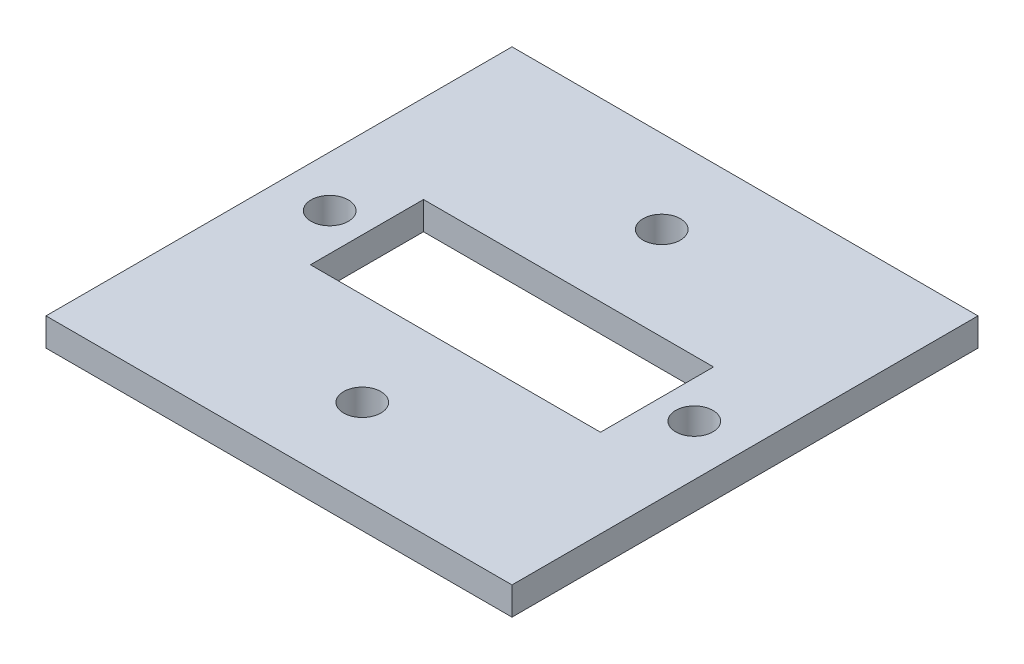
ISO-10303-21;
HEADER;
FILE_DESCRIPTION(('STEP AP214'),'2;1');
FILE_NAME('part.step','',(''),(''),'','','');
FILE_SCHEMA(('AUTOMOTIVE_DESIGN { 1 0 10303 214 1 1 1 1 }'));
ENDSEC;
DATA;
#1=APPLICATION_CONTEXT('core data for automotive mechanical design processes');
#2=APPLICATION_PROTOCOL_DEFINITION('international standard','automotive_design',2000,#1);
#3=PRODUCT_CONTEXT('',#1,'mechanical');
#4=PRODUCT('Part','Part','',(#3));
#5=PRODUCT_RELATED_PRODUCT_CATEGORY('part','',(#4));
#6=PRODUCT_DEFINITION_FORMATION('','',#4);
#7=PRODUCT_DEFINITION_CONTEXT('part definition',#1,'design');
#8=PRODUCT_DEFINITION('design','',#6,#7);
#9=PRODUCT_DEFINITION_SHAPE('','',#8);
#10=(LENGTH_UNIT() NAMED_UNIT(*) SI_UNIT(.MILLI.,.METRE.));
#11=(NAMED_UNIT(*) PLANE_ANGLE_UNIT() SI_UNIT($,.RADIAN.));
#12=(NAMED_UNIT(*) SI_UNIT($,.STERADIAN.) SOLID_ANGLE_UNIT());
#13=UNCERTAINTY_MEASURE_WITH_UNIT(LENGTH_MEASURE(1.E-05),#10,'distance_accuracy_value','');
#14=(GEOMETRIC_REPRESENTATION_CONTEXT(3) GLOBAL_UNCERTAINTY_ASSIGNED_CONTEXT((#13)) GLOBAL_UNIT_ASSIGNED_CONTEXT((#10,
#11,#12)) REPRESENTATION_CONTEXT('',''));
#15=CARTESIAN_POINT('',(0.,0.,0.));
#16=DIRECTION('',(0.,0.,1.));
#17=DIRECTION('',(1.,0.,0.));
#18=AXIS2_PLACEMENT_3D('',#15,#16,#17);
#19=CARTESIAN_POINT('',(0.,3.,0.));
#20=DIRECTION('',(1.,0.,0.));
#21=DIRECTION('',(0.,0.,-1.));
#22=AXIS2_PLACEMENT_3D('',#19,#20,#21);
#23=PLANE('',#22);
#24=DIRECTION('',(0.,0.,1.));
#25=VECTOR('',#24,1.);
#26=CARTESIAN_POINT('',(0.,0.,0.));
#27=LINE('',#26,#25);
#28=CARTESIAN_POINT('',(0.,0.,-50.));
#29=VERTEX_POINT('',#28);
#30=CARTESIAN_POINT('',(0.,0.,0.));
#31=VERTEX_POINT('',#30);
#32=EDGE_CURVE('E134',#29,#31,#27,.T.);
#33=ORIENTED_EDGE('',*,*,#32,.T.);
#34=DIRECTION('',(0.,-1.,0.));
#35=VECTOR('',#34,1.);
#36=CARTESIAN_POINT('',(0.,3.,0.));
#37=LINE('',#36,#35);
#38=CARTESIAN_POINT('',(0.,3.,0.));
#39=VERTEX_POINT('',#38);
#40=EDGE_CURVE('E11',#39,#31,#37,.T.);
#41=ORIENTED_EDGE('',*,*,#40,.F.);
#42=DIRECTION('',(0.,0.,1.));
#43=VECTOR('',#42,1.);
#44=CARTESIAN_POINT('',(0.,3.,0.));
#45=LINE('',#44,#43);
#46=CARTESIAN_POINT('',(0.,3.,-50.));
#47=VERTEX_POINT('',#46);
#48=EDGE_CURVE('E138',#47,#39,#45,.T.);
#49=ORIENTED_EDGE('',*,*,#48,.F.);
#50=DIRECTION('',(0.,-1.,0.));
#51=VECTOR('',#50,1.);
#52=CARTESIAN_POINT('',(0.,3.,-50.));
#53=LINE('',#52,#51);
#54=EDGE_CURVE('E148',#47,#29,#53,.T.);
#55=ORIENTED_EDGE('',*,*,#54,.T.);
#56=EDGE_LOOP('',(#33,#41,#49,#55));
#57=FACE_BOUND('',#56,.T.);
#58=ADVANCED_FACE('F33',(#57),#23,.F.);
#59=CARTESIAN_POINT('',(0.,3.,0.));
#60=DIRECTION('',(0.,0.,-1.));
#61=DIRECTION('',(-1.,0.,0.));
#62=AXIS2_PLACEMENT_3D('',#59,#60,#61);
#63=PLANE('',#62);
#64=DIRECTION('',(1.,0.,0.));
#65=VECTOR('',#64,1.);
#66=CARTESIAN_POINT('',(0.,0.,0.));
#67=LINE('',#66,#65);
#68=CARTESIAN_POINT('',(50.,0.,0.));
#69=VERTEX_POINT('',#68);
#70=EDGE_CURVE('E151',#31,#69,#67,.T.);
#71=ORIENTED_EDGE('',*,*,#70,.T.);
#72=DIRECTION('',(0.,-1.,0.));
#73=VECTOR('',#72,1.);
#74=CARTESIAN_POINT('',(50.,3.,0.));
#75=LINE('',#74,#73);
#76=CARTESIAN_POINT('',(50.,3.,0.));
#77=VERTEX_POINT('',#76);
#78=EDGE_CURVE('E40',#77,#69,#75,.T.);
#79=ORIENTED_EDGE('',*,*,#78,.F.);
#80=DIRECTION('',(1.,0.,0.));
#81=VECTOR('',#80,1.);
#82=CARTESIAN_POINT('',(0.,3.,0.));
#83=LINE('',#82,#81);
#84=EDGE_CURVE('E141',#39,#77,#83,.T.);
#85=ORIENTED_EDGE('',*,*,#84,.F.);
#86=ORIENTED_EDGE('',*,*,#40,.T.);
#87=EDGE_LOOP('',(#71,#79,#85,#86));
#88=FACE_BOUND('',#87,.T.);
#89=ADVANCED_FACE('F179',(#88),#63,.F.);
#90=CARTESIAN_POINT('',(50.,3.,0.));
#91=DIRECTION('',(-1.,0.,0.));
#92=DIRECTION('',(0.,0.,1.));
#93=AXIS2_PLACEMENT_3D('',#90,#91,#92);
#94=PLANE('',#93);
#95=DIRECTION('',(0.,0.,-1.));
#96=VECTOR('',#95,1.);
#97=CARTESIAN_POINT('',(50.,0.,0.));
#98=LINE('',#97,#96);
#99=CARTESIAN_POINT('',(50.,0.,-50.));
#100=VERTEX_POINT('',#99);
#101=EDGE_CURVE('E153',#69,#100,#98,.T.);
#102=ORIENTED_EDGE('',*,*,#101,.T.);
#103=DIRECTION('',(0.,-1.,0.));
#104=VECTOR('',#103,1.);
#105=CARTESIAN_POINT('',(50.,3.,-50.));
#106=LINE('',#105,#104);
#107=CARTESIAN_POINT('',(50.,3.,-50.));
#108=VERTEX_POINT('',#107);
#109=EDGE_CURVE('E158',#108,#100,#106,.T.);
#110=ORIENTED_EDGE('',*,*,#109,.F.);
#111=DIRECTION('',(0.,0.,-1.));
#112=VECTOR('',#111,1.);
#113=CARTESIAN_POINT('',(50.,3.,0.));
#114=LINE('',#113,#112);
#115=EDGE_CURVE('E144',#77,#108,#114,.T.);
#116=ORIENTED_EDGE('',*,*,#115,.F.);
#117=ORIENTED_EDGE('',*,*,#78,.T.);
#118=EDGE_LOOP('',(#102,#110,#116,#117));
#119=FACE_BOUND('',#118,.T.);
#120=ADVANCED_FACE('F165',(#119),#94,.F.);
#121=CARTESIAN_POINT('',(0.,3.,-50.));
#122=DIRECTION('',(0.,0.,1.));
#123=DIRECTION('',(1.,0.,0.));
#124=AXIS2_PLACEMENT_3D('',#121,#122,#123);
#125=PLANE('',#124);
#126=DIRECTION('',(-1.,0.,0.));
#127=VECTOR('',#126,1.);
#128=CARTESIAN_POINT('',(0.,0.,-50.));
#129=LINE('',#128,#127);
#130=EDGE_CURVE('E142',#100,#29,#129,.T.);
#131=ORIENTED_EDGE('',*,*,#130,.T.);
#132=ORIENTED_EDGE('',*,*,#54,.F.);
#133=DIRECTION('',(-1.,0.,0.));
#134=VECTOR('',#133,1.);
#135=CARTESIAN_POINT('',(0.,3.,-50.));
#136=LINE('',#135,#134);
#137=EDGE_CURVE('E146',#108,#47,#136,.T.);
#138=ORIENTED_EDGE('',*,*,#137,.F.);
#139=ORIENTED_EDGE('',*,*,#109,.T.);
#140=EDGE_LOOP('',(#131,#132,#138,#139));
#141=FACE_BOUND('',#140,.T.);
#142=ADVANCED_FACE('F172',(#141),#125,.F.);
#143=CARTESIAN_POINT('',(0.,3.,0.));
#144=DIRECTION('',(0.,-1.,0.));
#145=DIRECTION('',(0.,0.,-1.));
#146=AXIS2_PLACEMENT_3D('',#143,#144,#145);
#147=PLANE('',#146);
#148=CARTESIAN_POINT('',(25.,3.,-41.065));
#149=DIRECTION('',(0.,1.,0.));
#150=DIRECTION('',(0.,0.,1.));
#151=AXIS2_PLACEMENT_3D('',#148,#149,#150);
#152=CIRCLE('',#151,2.);
#153=CARTESIAN_POINT('',(25.,3.,-39.065));
#154=VERTEX_POINT('',#153);
#155=EDGE_CURVE('E242',#154,#154,#152,.T.);
#156=ORIENTED_EDGE('',*,*,#155,.F.);
#157=EDGE_LOOP('',(#156));
#158=FACE_BOUND('',#157,.T.);
#159=CARTESIAN_POINT('',(25.,3.,-8.935));
#160=DIRECTION('',(0.,1.,0.));
#161=DIRECTION('',(0.,0.,1.));
#162=AXIS2_PLACEMENT_3D('',#159,#160,#161);
#163=CIRCLE('',#162,2.);
#164=CARTESIAN_POINT('',(25.,3.,-6.935));
#165=VERTEX_POINT('',#164);
#166=EDGE_CURVE('E121',#165,#165,#163,.T.);
#167=ORIENTED_EDGE('',*,*,#166,.F.);
#168=EDGE_LOOP('',(#167));
#169=FACE_BOUND('',#168,.T.);
#170=CARTESIAN_POINT('',(44.56,3.,-25.));
#171=DIRECTION('',(0.,1.,0.));
#172=DIRECTION('',(0.,0.,1.));
#173=AXIS2_PLACEMENT_3D('',#170,#171,#172);
#174=CIRCLE('',#173,2.);
#175=CARTESIAN_POINT('',(44.56,3.,-23.));
#176=VERTEX_POINT('',#175);
#177=EDGE_CURVE('E229',#176,#176,#174,.T.);
#178=ORIENTED_EDGE('',*,*,#177,.F.);
#179=EDGE_LOOP('',(#178));
#180=FACE_BOUND('',#179,.T.);
#181=CARTESIAN_POINT('',(5.44000000000001,3.,-25.));
#182=DIRECTION('',(0.,1.,0.));
#183=DIRECTION('',(0.,0.,1.));
#184=AXIS2_PLACEMENT_3D('',#181,#182,#183);
#185=CIRCLE('',#184,2.);
#186=CARTESIAN_POINT('',(5.44000000000001,3.,-23.));
#187=VERTEX_POINT('',#186);
#188=EDGE_CURVE('E235',#187,#187,#185,.T.);
#189=ORIENTED_EDGE('',*,*,#188,.F.);
#190=EDGE_LOOP('',(#189));
#191=FACE_BOUND('',#190,.T.);
#192=DIRECTION('',(1.,0.,0.));
#193=VECTOR('',#192,1.);
#194=CARTESIAN_POINT('',(9.44000000000001,3.,-18.935));
#195=LINE('',#194,#193);
#196=CARTESIAN_POINT('',(9.44000000000001,3.,-18.935));
#197=VERTEX_POINT('',#196);
#198=CARTESIAN_POINT('',(40.56,3.,-18.935));
#199=VERTEX_POINT('',#198);
#200=EDGE_CURVE('E127',#197,#199,#195,.T.);
#201=ORIENTED_EDGE('',*,*,#200,.F.);
#202=DIRECTION('',(0.,0.,1.));
#203=VECTOR('',#202,1.);
#204=CARTESIAN_POINT('',(9.44000000000001,3.,-31.065));
#205=LINE('',#204,#203);
#206=CARTESIAN_POINT('',(9.44000000000001,3.,-31.065));
#207=VERTEX_POINT('',#206);
#208=EDGE_CURVE('E47',#207,#197,#205,.T.);
#209=ORIENTED_EDGE('',*,*,#208,.F.);
#210=DIRECTION('',(-1.,0.,0.));
#211=VECTOR('',#210,1.);
#212=CARTESIAN_POINT('',(9.44000000000001,3.,-31.065));
#213=LINE('',#212,#211);
#214=CARTESIAN_POINT('',(40.56,3.,-31.065));
#215=VERTEX_POINT('',#214);
#216=EDGE_CURVE('E115',#215,#207,#213,.T.);
#217=ORIENTED_EDGE('',*,*,#216,.F.);
#218=DIRECTION('',(0.,0.,-1.));
#219=VECTOR('',#218,1.);
#220=CARTESIAN_POINT('',(40.56,3.,-18.935));
#221=LINE('',#220,#219);
#222=EDGE_CURVE('E118',#199,#215,#221,.T.);
#223=ORIENTED_EDGE('',*,*,#222,.F.);
#224=EDGE_LOOP('',(#201,#209,#217,#223));
#225=FACE_BOUND('',#224,.T.);
#226=ORIENTED_EDGE('',*,*,#48,.T.);
#227=ORIENTED_EDGE('',*,*,#84,.T.);
#228=ORIENTED_EDGE('',*,*,#115,.T.);
#229=ORIENTED_EDGE('',*,*,#137,.T.);
#230=EDGE_LOOP('',(#226,#227,#228,#229));
#231=FACE_BOUND('',#230,.T.);
#232=ADVANCED_FACE('F178',(#158,#169,#180,#191,#225,#231),#147,.F.);
#233=CARTESIAN_POINT('',(0.,0.,0.));
#234=DIRECTION('',(0.,-1.,0.));
#235=DIRECTION('',(0.,0.,-1.));
#236=AXIS2_PLACEMENT_3D('',#233,#234,#235);
#237=PLANE('',#236);
#238=CARTESIAN_POINT('',(25.,0.,-41.065));
#239=DIRECTION('',(0.,1.,0.));
#240=DIRECTION('',(0.,0.,1.));
#241=AXIS2_PLACEMENT_3D('',#238,#239,#240);
#242=CIRCLE('',#241,2.);
#243=CARTESIAN_POINT('',(25.,0.,-39.065));
#244=VERTEX_POINT('',#243);
#245=EDGE_CURVE('E128',#244,#244,#242,.T.);
#246=ORIENTED_EDGE('',*,*,#245,.T.);
#247=EDGE_LOOP('',(#246));
#248=FACE_BOUND('',#247,.T.);
#249=CARTESIAN_POINT('',(25.,0.,-8.935));
#250=DIRECTION('',(0.,1.,0.));
#251=DIRECTION('',(0.,0.,1.));
#252=AXIS2_PLACEMENT_3D('',#249,#250,#251);
#253=CIRCLE('',#252,2.);
#254=CARTESIAN_POINT('',(25.,0.,-6.935));
#255=VERTEX_POINT('',#254);
#256=EDGE_CURVE('E244',#255,#255,#253,.T.);
#257=ORIENTED_EDGE('',*,*,#256,.T.);
#258=EDGE_LOOP('',(#257));
#259=FACE_BOUND('',#258,.T.);
#260=CARTESIAN_POINT('',(44.56,0.,-25.));
#261=DIRECTION('',(0.,1.,0.));
#262=DIRECTION('',(0.,0.,1.));
#263=AXIS2_PLACEMENT_3D('',#260,#261,#262);
#264=CIRCLE('',#263,2.);
#265=CARTESIAN_POINT('',(44.56,0.,-23.));
#266=VERTEX_POINT('',#265);
#267=EDGE_CURVE('E226',#266,#266,#264,.T.);
#268=ORIENTED_EDGE('',*,*,#267,.T.);
#269=EDGE_LOOP('',(#268));
#270=FACE_BOUND('',#269,.T.);
#271=CARTESIAN_POINT('',(5.44000000000001,0.,-25.));
#272=DIRECTION('',(0.,1.,0.));
#273=DIRECTION('',(0.,0.,1.));
#274=AXIS2_PLACEMENT_3D('',#271,#272,#273);
#275=CIRCLE('',#274,2.);
#276=CARTESIAN_POINT('',(5.44000000000001,0.,-23.));
#277=VERTEX_POINT('',#276);
#278=EDGE_CURVE('E231',#277,#277,#275,.T.);
#279=ORIENTED_EDGE('',*,*,#278,.T.);
#280=EDGE_LOOP('',(#279));
#281=FACE_BOUND('',#280,.T.);
#282=DIRECTION('',(0.,0.,1.));
#283=VECTOR('',#282,1.);
#284=CARTESIAN_POINT('',(9.44000000000001,0.,-31.065));
#285=LINE('',#284,#283);
#286=CARTESIAN_POINT('',(9.44000000000001,0.,-31.065));
#287=VERTEX_POINT('',#286);
#288=CARTESIAN_POINT('',(9.44000000000001,0.,-18.935));
#289=VERTEX_POINT('',#288);
#290=EDGE_CURVE('E99',#287,#289,#285,.T.);
#291=ORIENTED_EDGE('',*,*,#290,.T.);
#292=DIRECTION('',(1.,0.,0.));
#293=VECTOR('',#292,1.);
#294=CARTESIAN_POINT('',(9.44000000000001,0.,-18.935));
#295=LINE('',#294,#293);
#296=CARTESIAN_POINT('',(40.56,0.,-18.935));
#297=VERTEX_POINT('',#296);
#298=EDGE_CURVE('E108',#289,#297,#295,.T.);
#299=ORIENTED_EDGE('',*,*,#298,.T.);
#300=DIRECTION('',(0.,0.,-1.));
#301=VECTOR('',#300,1.);
#302=CARTESIAN_POINT('',(40.56,0.,-18.935));
#303=LINE('',#302,#301);
#304=CARTESIAN_POINT('',(40.56,0.,-31.065));
#305=VERTEX_POINT('',#304);
#306=EDGE_CURVE('E55',#297,#305,#303,.T.);
#307=ORIENTED_EDGE('',*,*,#306,.T.);
#308=DIRECTION('',(-1.,0.,0.));
#309=VECTOR('',#308,1.);
#310=CARTESIAN_POINT('',(9.44000000000001,0.,-31.065));
#311=LINE('',#310,#309);
#312=EDGE_CURVE('E105',#305,#287,#311,.T.);
#313=ORIENTED_EDGE('',*,*,#312,.T.);
#314=EDGE_LOOP('',(#291,#299,#307,#313));
#315=FACE_BOUND('',#314,.T.);
#316=ORIENTED_EDGE('',*,*,#32,.F.);
#317=ORIENTED_EDGE('',*,*,#130,.F.);
#318=ORIENTED_EDGE('',*,*,#101,.F.);
#319=ORIENTED_EDGE('',*,*,#70,.F.);
#320=EDGE_LOOP('',(#316,#317,#318,#319));
#321=FACE_BOUND('',#320,.T.);
#322=ADVANCED_FACE('F112',(#248,#259,#270,#281,#315,#321),#237,.T.);
#323=CARTESIAN_POINT('',(9.44000000000001,0.,-31.065));
#324=DIRECTION('',(-1.,0.,0.));
#325=DIRECTION('',(0.,0.,1.));
#326=AXIS2_PLACEMENT_3D('',#323,#324,#325);
#327=PLANE('',#326);
#328=ORIENTED_EDGE('',*,*,#208,.T.);
#329=DIRECTION('',(0.,1.,0.));
#330=VECTOR('',#329,1.);
#331=CARTESIAN_POINT('',(9.44000000000001,0.,-18.935));
#332=LINE('',#331,#330);
#333=EDGE_CURVE('E95',#289,#197,#332,.T.);
#334=ORIENTED_EDGE('',*,*,#333,.F.);
#335=ORIENTED_EDGE('',*,*,#290,.F.);
#336=DIRECTION('',(0.,1.,0.));
#337=VECTOR('',#336,1.);
#338=CARTESIAN_POINT('',(9.44000000000001,0.,-31.065));
#339=LINE('',#338,#337);
#340=EDGE_CURVE('E132',#287,#207,#339,.T.);
#341=ORIENTED_EDGE('',*,*,#340,.T.);
#342=EDGE_LOOP('',(#328,#334,#335,#341));
#343=FACE_BOUND('',#342,.T.);
#344=ADVANCED_FACE('F97',(#343),#327,.F.);
#345=CARTESIAN_POINT('',(9.44000000000001,0.,-31.065));
#346=DIRECTION('',(0.,0.,-1.));
#347=DIRECTION('',(-1.,0.,0.));
#348=AXIS2_PLACEMENT_3D('',#345,#346,#347);
#349=PLANE('',#348);
#350=ORIENTED_EDGE('',*,*,#216,.T.);
#351=ORIENTED_EDGE('',*,*,#340,.F.);
#352=ORIENTED_EDGE('',*,*,#312,.F.);
#353=DIRECTION('',(0.,1.,0.));
#354=VECTOR('',#353,1.);
#355=CARTESIAN_POINT('',(40.56,0.,-31.065));
#356=LINE('',#355,#354);
#357=EDGE_CURVE('E135',#305,#215,#356,.T.);
#358=ORIENTED_EDGE('',*,*,#357,.T.);
#359=EDGE_LOOP('',(#350,#351,#352,#358));
#360=FACE_BOUND('',#359,.T.);
#361=ADVANCED_FACE('F197',(#360),#349,.F.);
#362=CARTESIAN_POINT('',(40.56,0.,-18.935));
#363=DIRECTION('',(1.,0.,0.));
#364=DIRECTION('',(0.,0.,-1.));
#365=AXIS2_PLACEMENT_3D('',#362,#363,#364);
#366=PLANE('',#365);
#367=ORIENTED_EDGE('',*,*,#222,.T.);
#368=ORIENTED_EDGE('',*,*,#357,.F.);
#369=ORIENTED_EDGE('',*,*,#306,.F.);
#370=DIRECTION('',(0.,1.,0.));
#371=VECTOR('',#370,1.);
#372=CARTESIAN_POINT('',(40.56,0.,-18.935));
#373=LINE('',#372,#371);
#374=EDGE_CURVE('E104',#297,#199,#373,.T.);
#375=ORIENTED_EDGE('',*,*,#374,.T.);
#376=EDGE_LOOP('',(#367,#368,#369,#375));
#377=FACE_BOUND('',#376,.T.);
#378=ADVANCED_FACE('F201',(#377),#366,.F.);
#379=CARTESIAN_POINT('',(9.44000000000001,0.,-18.935));
#380=DIRECTION('',(0.,0.,1.));
#381=DIRECTION('',(1.,0.,0.));
#382=AXIS2_PLACEMENT_3D('',#379,#380,#381);
#383=PLANE('',#382);
#384=ORIENTED_EDGE('',*,*,#200,.T.);
#385=ORIENTED_EDGE('',*,*,#374,.F.);
#386=ORIENTED_EDGE('',*,*,#298,.F.);
#387=ORIENTED_EDGE('',*,*,#333,.T.);
#388=EDGE_LOOP('',(#384,#385,#386,#387));
#389=FACE_BOUND('',#388,.T.);
#390=ADVANCED_FACE('F109',(#389),#383,.F.);
#391=CARTESIAN_POINT('',(5.44000000000001,0.,-25.));
#392=DIRECTION('',(0.,1.,0.));
#393=DIRECTION('',(0.,0.,1.));
#394=AXIS2_PLACEMENT_3D('',#391,#392,#393);
#395=CYLINDRICAL_SURFACE('',#394,2.);
#396=ORIENTED_EDGE('',*,*,#278,.F.);
#397=EDGE_LOOP('',(#396));
#398=FACE_BOUND('',#397,.T.);
#399=ORIENTED_EDGE('',*,*,#188,.T.);
#400=EDGE_LOOP('',(#399));
#401=FACE_BOUND('',#400,.T.);
#402=ADVANCED_FACE('F200',(#398,#401),#395,.F.);
#403=CARTESIAN_POINT('',(44.56,0.,-25.));
#404=DIRECTION('',(0.,1.,0.));
#405=DIRECTION('',(0.,0.,1.));
#406=AXIS2_PLACEMENT_3D('',#403,#404,#405);
#407=CYLINDRICAL_SURFACE('',#406,2.);
#408=ORIENTED_EDGE('',*,*,#267,.F.);
#409=EDGE_LOOP('',(#408));
#410=FACE_BOUND('',#409,.T.);
#411=ORIENTED_EDGE('',*,*,#177,.T.);
#412=EDGE_LOOP('',(#411));
#413=FACE_BOUND('',#412,.T.);
#414=ADVANCED_FACE('F211',(#410,#413),#407,.F.);
#415=CARTESIAN_POINT('',(25.,0.,-8.935));
#416=DIRECTION('',(0.,1.,0.));
#417=DIRECTION('',(0.,0.,1.));
#418=AXIS2_PLACEMENT_3D('',#415,#416,#417);
#419=CYLINDRICAL_SURFACE('',#418,2.);
#420=ORIENTED_EDGE('',*,*,#256,.F.);
#421=EDGE_LOOP('',(#420));
#422=FACE_BOUND('',#421,.T.);
#423=ORIENTED_EDGE('',*,*,#166,.T.);
#424=EDGE_LOOP('',(#423));
#425=FACE_BOUND('',#424,.T.);
#426=ADVANCED_FACE('F207',(#422,#425),#419,.F.);
#427=CARTESIAN_POINT('',(25.,0.,-41.065));
#428=DIRECTION('',(0.,1.,0.));
#429=DIRECTION('',(0.,0.,1.));
#430=AXIS2_PLACEMENT_3D('',#427,#428,#429);
#431=CYLINDRICAL_SURFACE('',#430,2.);
#432=ORIENTED_EDGE('',*,*,#245,.F.);
#433=EDGE_LOOP('',(#432));
#434=FACE_BOUND('',#433,.T.);
#435=ORIENTED_EDGE('',*,*,#155,.T.);
#436=EDGE_LOOP('',(#435));
#437=FACE_BOUND('',#436,.T.);
#438=ADVANCED_FACE('F210',(#434,#437),#431,.F.);
#439=CLOSED_SHELL('',(#58,#89,#120,#142,#232,#322,#344,#361,#378,#390,#402,#414,#426,#438));
#440=MANIFOLD_SOLID_BREP('B2',#439);
#441=ADVANCED_BREP_SHAPE_REPRESENTATION('',(#18,#440),#14);
#442=SHAPE_DEFINITION_REPRESENTATION(#9,#441);
ENDSEC;
END-ISO-10303-21;
